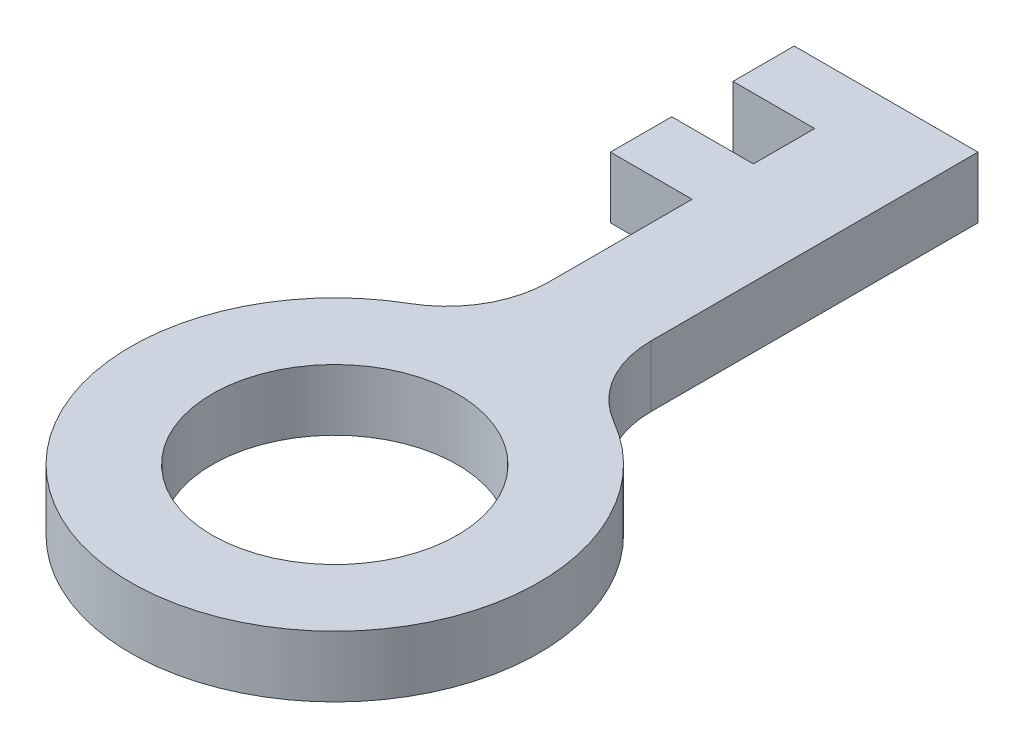
ISO-10303-21;
HEADER;
FILE_DESCRIPTION(('STEP AP214'),'2;1');
FILE_NAME('part.step','',(''),(''),'','','');
FILE_SCHEMA(('AUTOMOTIVE_DESIGN { 1 0 10303 214 1 1 1 1 }'));
ENDSEC;
DATA;
#1=APPLICATION_CONTEXT('core data for automotive mechanical design processes');
#2=APPLICATION_PROTOCOL_DEFINITION('international standard','automotive_design',2000,#1);
#3=PRODUCT_CONTEXT('',#1,'mechanical');
#4=PRODUCT('Part','Part','',(#3));
#5=PRODUCT_RELATED_PRODUCT_CATEGORY('part','',(#4));
#6=PRODUCT_DEFINITION_FORMATION('','',#4);
#7=PRODUCT_DEFINITION_CONTEXT('part definition',#1,'design');
#8=PRODUCT_DEFINITION('design','',#6,#7);
#9=PRODUCT_DEFINITION_SHAPE('','',#8);
#10=(LENGTH_UNIT() NAMED_UNIT(*) SI_UNIT(.MILLI.,.METRE.));
#11=(NAMED_UNIT(*) PLANE_ANGLE_UNIT() SI_UNIT($,.RADIAN.));
#12=(NAMED_UNIT(*) SI_UNIT($,.STERADIAN.) SOLID_ANGLE_UNIT());
#13=UNCERTAINTY_MEASURE_WITH_UNIT(LENGTH_MEASURE(1.E-05),#10,'distance_accuracy_value','');
#14=(GEOMETRIC_REPRESENTATION_CONTEXT(3) GLOBAL_UNCERTAINTY_ASSIGNED_CONTEXT((#13)) GLOBAL_UNIT_ASSIGNED_CONTEXT((#10,
#11,#12)) REPRESENTATION_CONTEXT('',''));
#15=CARTESIAN_POINT('',(0.,0.,0.));
#16=DIRECTION('',(0.,0.,1.));
#17=DIRECTION('',(1.,0.,0.));
#18=AXIS2_PLACEMENT_3D('',#15,#16,#17);
#19=CARTESIAN_POINT('',(-2.5,0.,-9.));
#20=DIRECTION('',(-1.,0.,0.));
#21=DIRECTION('',(0.,0.,1.));
#22=AXIS2_PLACEMENT_3D('',#19,#20,#21);
#23=PLANE('',#22);
#24=DIRECTION('',(0.,0.,1.));
#25=VECTOR('',#24,1.);
#26=CARTESIAN_POINT('',(-2.5,0.,-9.));
#27=LINE('',#26,#25);
#28=CARTESIAN_POINT('',(-2.5,0.,-26.));
#29=VERTEX_POINT('',#28);
#30=CARTESIAN_POINT('',(-2.5,0.,-23.));
#31=VERTEX_POINT('',#30);
#32=EDGE_CURVE('E169',#29,#31,#27,.T.);
#33=ORIENTED_EDGE('',*,*,#32,.T.);
#34=DIRECTION('',(0.,-1.,0.));
#35=VECTOR('',#34,1.);
#36=CARTESIAN_POINT('',(-2.5,0.,-23.));
#37=LINE('',#36,#35);
#38=CARTESIAN_POINT('',(-2.5,3.,-23.));
#39=VERTEX_POINT('',#38);
#40=EDGE_CURVE('E145',#39,#31,#37,.T.);
#41=ORIENTED_EDGE('',*,*,#40,.F.);
#42=DIRECTION('',(0.,0.,1.));
#43=VECTOR('',#42,1.);
#44=CARTESIAN_POINT('',(-2.5,3.,-9.));
#45=LINE('',#44,#43);
#46=CARTESIAN_POINT('',(-2.5,3.,-26.));
#47=VERTEX_POINT('',#46);
#48=EDGE_CURVE('E177',#47,#39,#45,.T.);
#49=ORIENTED_EDGE('',*,*,#48,.F.);
#50=DIRECTION('',(0.,1.,0.));
#51=VECTOR('',#50,1.);
#52=CARTESIAN_POINT('',(-2.5,0.,-26.));
#53=LINE('',#52,#51);
#54=EDGE_CURVE('E146',#29,#47,#53,.T.);
#55=ORIENTED_EDGE('',*,*,#54,.F.);
#56=EDGE_LOOP('',(#33,#41,#49,#55));
#57=FACE_BOUND('',#56,.T.);
#58=ADVANCED_FACE('F33',(#57),#23,.T.);
#59=CARTESIAN_POINT('',(-2.5,0.,-20.));
#60=VERTEX_POINT('',#59);
#61=CARTESIAN_POINT('',(-2.5,0.,-12.9903810567666));
#62=VERTEX_POINT('',#61);
#63=EDGE_CURVE('E172',#60,#62,#27,.T.);
#64=ORIENTED_EDGE('',*,*,#63,.T.);
#65=DIRECTION('',(0.,-1.,0.));
#66=VECTOR('',#65,1.);
#67=CARTESIAN_POINT('',(-2.5,0.,-12.9903810567666));
#68=LINE('',#67,#66);
#69=CARTESIAN_POINT('',(-2.5,3.,-12.9903810567666));
#70=VERTEX_POINT('',#69);
#71=EDGE_CURVE('E197',#62,#70,#68,.F.);
#72=ORIENTED_EDGE('',*,*,#71,.T.);
#73=CARTESIAN_POINT('',(-2.5,3.,-20.));
#74=VERTEX_POINT('',#73);
#75=EDGE_CURVE('E168',#74,#70,#45,.T.);
#76=ORIENTED_EDGE('',*,*,#75,.F.);
#77=DIRECTION('',(0.,1.,0.));
#78=VECTOR('',#77,1.);
#79=CARTESIAN_POINT('',(-2.5,0.,-20.));
#80=LINE('',#79,#78);
#81=EDGE_CURVE('E142',#60,#74,#80,.T.);
#82=ORIENTED_EDGE('',*,*,#81,.F.);
#83=EDGE_LOOP('',(#64,#72,#76,#82));
#84=FACE_BOUND('',#83,.T.);
#85=ADVANCED_FACE('F218',(#84),#23,.T.);
#86=CARTESIAN_POINT('',(0.,3.,0.));
#87=DIRECTION('',(0.,-1.,0.));
#88=DIRECTION('',(0.,0.,-1.));
#89=AXIS2_PLACEMENT_3D('',#86,#87,#88);
#90=CYLINDRICAL_SURFACE('',#89,10.);
#91=CARTESIAN_POINT('',(0.,3.,0.));
#92=DIRECTION('',(0.,1.,0.));
#93=DIRECTION('',(0.,0.,1.));
#94=AXIS2_PLACEMENT_3D('',#91,#92,#93);
#95=CIRCLE('',#94,10.);
#96=CARTESIAN_POINT('',(-5.,3.,-8.66025403784439));
#97=VERTEX_POINT('',#96);
#98=CARTESIAN_POINT('',(5.,3.,-8.66025403784439));
#99=VERTEX_POINT('',#98);
#100=EDGE_CURVE('E187',#97,#99,#95,.T.);
#101=ORIENTED_EDGE('',*,*,#100,.F.);
#102=DIRECTION('',(0.,-1.,0.));
#103=VECTOR('',#102,1.);
#104=CARTESIAN_POINT('',(-5.,3.,-8.66025403784439));
#105=LINE('',#104,#103);
#106=CARTESIAN_POINT('',(-5.,0.,-8.66025403784439));
#107=VERTEX_POINT('',#106);
#108=EDGE_CURVE('E194',#97,#107,#105,.T.);
#109=ORIENTED_EDGE('',*,*,#108,.T.);
#110=CARTESIAN_POINT('',(0.,0.,0.));
#111=DIRECTION('',(0.,1.,0.));
#112=DIRECTION('',(0.,0.,1.));
#113=AXIS2_PLACEMENT_3D('',#110,#111,#112);
#114=CIRCLE('',#113,10.);
#115=CARTESIAN_POINT('',(5.,0.,-8.66025403784439));
#116=VERTEX_POINT('',#115);
#117=EDGE_CURVE('E186',#107,#116,#114,.T.);
#118=ORIENTED_EDGE('',*,*,#117,.T.);
#119=DIRECTION('',(0.,-1.,0.));
#120=VECTOR('',#119,1.);
#121=CARTESIAN_POINT('',(5.,3.,-8.66025403784439));
#122=LINE('',#121,#120);
#123=EDGE_CURVE('E189',#116,#99,#122,.F.);
#124=ORIENTED_EDGE('',*,*,#123,.T.);
#125=EDGE_LOOP('',(#101,#109,#118,#124));
#126=FACE_BOUND('',#125,.T.);
#127=ADVANCED_FACE('F212',(#126),#90,.T.);
#128=CARTESIAN_POINT('',(0.,3.,0.));
#129=DIRECTION('',(0.,1.,0.));
#130=DIRECTION('',(0.,0.,1.));
#131=AXIS2_PLACEMENT_3D('',#128,#129,#130);
#132=PLANE('',#131);
#133=CARTESIAN_POINT('',(0.,3.,0.));
#134=DIRECTION('',(0.,1.,0.));
#135=DIRECTION('',(0.,0.,1.));
#136=AXIS2_PLACEMENT_3D('',#133,#134,#135);
#137=CIRCLE('',#136,6.);
#138=CARTESIAN_POINT('',(0.,3.,6.));
#139=VERTEX_POINT('',#138);
#140=EDGE_CURVE('E398',#139,#139,#137,.T.);
#141=ORIENTED_EDGE('',*,*,#140,.F.);
#142=EDGE_LOOP('',(#141));
#143=FACE_BOUND('',#142,.T.);
#144=ORIENTED_EDGE('',*,*,#75,.T.);
#145=CARTESIAN_POINT('',(-7.5,3.,-12.9903810567666));
#146=DIRECTION('',(0.,1.,0.));
#147=DIRECTION('',(0.,0.,1.));
#148=AXIS2_PLACEMENT_3D('',#145,#146,#147);
#149=CIRCLE('',#148,5.);
#150=EDGE_CURVE('E202',#70,#97,#149,.F.);
#151=ORIENTED_EDGE('',*,*,#150,.T.);
#152=ORIENTED_EDGE('',*,*,#100,.T.);
#153=CARTESIAN_POINT('',(7.5,3.,-12.9903810567666));
#154=DIRECTION('',(0.,1.,0.));
#155=DIRECTION('',(0.,0.,1.));
#156=AXIS2_PLACEMENT_3D('',#153,#154,#155);
#157=CIRCLE('',#156,5.);
#158=CARTESIAN_POINT('',(2.5,3.,-12.9903810567666));
#159=VERTEX_POINT('',#158);
#160=EDGE_CURVE('E41',#99,#159,#157,.F.);
#161=ORIENTED_EDGE('',*,*,#160,.T.);
#162=DIRECTION('',(0.,0.,-1.));
#163=VECTOR('',#162,1.);
#164=CARTESIAN_POINT('',(2.5,3.,-9.));
#165=LINE('',#164,#163);
#166=CARTESIAN_POINT('',(2.5,3.,-29.));
#167=VERTEX_POINT('',#166);
#168=EDGE_CURVE('E180',#159,#167,#165,.T.);
#169=ORIENTED_EDGE('',*,*,#168,.T.);
#170=DIRECTION('',(-1.,0.,0.));
#171=VECTOR('',#170,1.);
#172=CARTESIAN_POINT('',(-2.5,3.,-29.));
#173=LINE('',#172,#171);
#174=CARTESIAN_POINT('',(-6.5,3.,-29.));
#175=VERTEX_POINT('',#174);
#176=EDGE_CURVE('E182',#167,#175,#173,.T.);
#177=ORIENTED_EDGE('',*,*,#176,.T.);
#178=DIRECTION('',(0.,0.,-1.));
#179=VECTOR('',#178,1.);
#180=CARTESIAN_POINT('',(-6.5,3.,-29.));
#181=LINE('',#180,#179);
#182=CARTESIAN_POINT('',(-6.5,3.,-26.));
#183=VERTEX_POINT('',#182);
#184=EDGE_CURVE('E160',#183,#175,#181,.T.);
#185=ORIENTED_EDGE('',*,*,#184,.F.);
#186=DIRECTION('',(1.,0.,0.));
#187=VECTOR('',#186,1.);
#188=CARTESIAN_POINT('',(-6.5,3.,-26.));
#189=LINE('',#188,#187);
#190=EDGE_CURVE('E162',#183,#47,#189,.T.);
#191=ORIENTED_EDGE('',*,*,#190,.T.);
#192=ORIENTED_EDGE('',*,*,#48,.T.);
#193=DIRECTION('',(1.,0.,0.));
#194=VECTOR('',#193,1.);
#195=CARTESIAN_POINT('',(-6.5,3.,-23.));
#196=LINE('',#195,#194);
#197=CARTESIAN_POINT('',(-6.5,3.,-23.));
#198=VERTEX_POINT('',#197);
#199=EDGE_CURVE('E225',#198,#39,#196,.T.);
#200=ORIENTED_EDGE('',*,*,#199,.F.);
#201=DIRECTION('',(0.,0.,-1.));
#202=VECTOR('',#201,1.);
#203=CARTESIAN_POINT('',(-6.5,3.,-23.));
#204=LINE('',#203,#202);
#205=CARTESIAN_POINT('',(-6.5,3.,-20.));
#206=VERTEX_POINT('',#205);
#207=EDGE_CURVE('E138',#206,#198,#204,.T.);
#208=ORIENTED_EDGE('',*,*,#207,.F.);
#209=DIRECTION('',(1.,0.,0.));
#210=VECTOR('',#209,1.);
#211=CARTESIAN_POINT('',(-6.5,3.,-20.));
#212=LINE('',#211,#210);
#213=EDGE_CURVE('E150',#206,#74,#212,.T.);
#214=ORIENTED_EDGE('',*,*,#213,.T.);
#215=EDGE_LOOP('',(#144,#151,#152,#161,#169,#177,#185,#191,#192,#200,#208,#214));
#216=FACE_BOUND('',#215,.T.);
#217=ADVANCED_FACE('F206',(#143,#216),#132,.T.);
#218=CARTESIAN_POINT('',(0.,0.,0.));
#219=DIRECTION('',(0.,1.,0.));
#220=DIRECTION('',(0.,0.,1.));
#221=AXIS2_PLACEMENT_3D('',#218,#219,#220);
#222=PLANE('',#221);
#223=CARTESIAN_POINT('',(0.,0.,0.));
#224=DIRECTION('',(0.,1.,0.));
#225=DIRECTION('',(0.,0.,1.));
#226=AXIS2_PLACEMENT_3D('',#223,#224,#225);
#227=CIRCLE('',#226,6.);
#228=CARTESIAN_POINT('',(0.,0.,6.));
#229=VERTEX_POINT('',#228);
#230=EDGE_CURVE('E228',#229,#229,#227,.T.);
#231=ORIENTED_EDGE('',*,*,#230,.T.);
#232=EDGE_LOOP('',(#231));
#233=FACE_BOUND('',#232,.T.);
#234=ORIENTED_EDGE('',*,*,#117,.F.);
#235=CARTESIAN_POINT('',(-7.5,0.,-12.9903810567666));
#236=DIRECTION('',(0.,1.,0.));
#237=DIRECTION('',(0.,0.,1.));
#238=AXIS2_PLACEMENT_3D('',#235,#236,#237);
#239=CIRCLE('',#238,5.);
#240=EDGE_CURVE('E200',#107,#62,#239,.T.);
#241=ORIENTED_EDGE('',*,*,#240,.T.);
#242=ORIENTED_EDGE('',*,*,#63,.F.);
#243=DIRECTION('',(1.,0.,0.));
#244=VECTOR('',#243,1.);
#245=CARTESIAN_POINT('',(-6.5,0.,-20.));
#246=LINE('',#245,#244);
#247=CARTESIAN_POINT('',(-6.5,0.,-20.));
#248=VERTEX_POINT('',#247);
#249=EDGE_CURVE('E129',#248,#60,#246,.T.);
#250=ORIENTED_EDGE('',*,*,#249,.F.);
#251=DIRECTION('',(0.,0.,1.));
#252=VECTOR('',#251,1.);
#253=CARTESIAN_POINT('',(-6.5,0.,-23.));
#254=LINE('',#253,#252);
#255=CARTESIAN_POINT('',(-6.5,0.,-23.));
#256=VERTEX_POINT('',#255);
#257=EDGE_CURVE('E120',#256,#248,#254,.T.);
#258=ORIENTED_EDGE('',*,*,#257,.F.);
#259=DIRECTION('',(1.,0.,0.));
#260=VECTOR('',#259,1.);
#261=CARTESIAN_POINT('',(-6.5,0.,-23.));
#262=LINE('',#261,#260);
#263=EDGE_CURVE('E126',#256,#31,#262,.T.);
#264=ORIENTED_EDGE('',*,*,#263,.T.);
#265=ORIENTED_EDGE('',*,*,#32,.F.);
#266=DIRECTION('',(1.,0.,0.));
#267=VECTOR('',#266,1.);
#268=CARTESIAN_POINT('',(-6.5,0.,-26.));
#269=LINE('',#268,#267);
#270=CARTESIAN_POINT('',(-6.5,0.,-26.));
#271=VERTEX_POINT('',#270);
#272=EDGE_CURVE('E166',#271,#29,#269,.T.);
#273=ORIENTED_EDGE('',*,*,#272,.F.);
#274=DIRECTION('',(0.,0.,1.));
#275=VECTOR('',#274,1.);
#276=CARTESIAN_POINT('',(-6.5,0.,-29.));
#277=LINE('',#276,#275);
#278=CARTESIAN_POINT('',(-6.5,0.,-29.));
#279=VERTEX_POINT('',#278);
#280=EDGE_CURVE('E156',#279,#271,#277,.T.);
#281=ORIENTED_EDGE('',*,*,#280,.F.);
#282=DIRECTION('',(-1.,0.,0.));
#283=VECTOR('',#282,1.);
#284=CARTESIAN_POINT('',(-2.5,0.,-29.));
#285=LINE('',#284,#283);
#286=CARTESIAN_POINT('',(2.5,0.,-29.));
#287=VERTEX_POINT('',#286);
#288=EDGE_CURVE('E174',#287,#279,#285,.T.);
#289=ORIENTED_EDGE('',*,*,#288,.F.);
#290=DIRECTION('',(0.,0.,-1.));
#291=VECTOR('',#290,1.);
#292=CARTESIAN_POINT('',(2.5,0.,-9.));
#293=LINE('',#292,#291);
#294=CARTESIAN_POINT('',(2.5,0.,-12.9903810567666));
#295=VERTEX_POINT('',#294);
#296=EDGE_CURVE('E171',#295,#287,#293,.T.);
#297=ORIENTED_EDGE('',*,*,#296,.F.);
#298=CARTESIAN_POINT('',(7.5,0.,-12.9903810567666));
#299=DIRECTION('',(0.,1.,0.));
#300=DIRECTION('',(0.,0.,1.));
#301=AXIS2_PLACEMENT_3D('',#298,#299,#300);
#302=CIRCLE('',#301,5.);
#303=EDGE_CURVE('E11',#295,#116,#302,.T.);
#304=ORIENTED_EDGE('',*,*,#303,.T.);
#305=EDGE_LOOP('',(#234,#241,#242,#250,#258,#264,#265,#273,#281,#289,#297,#304));
#306=FACE_BOUND('',#305,.T.);
#307=ADVANCED_FACE('F123',(#233,#306),#222,.F.);
#308=CARTESIAN_POINT('',(2.5,0.,-9.));
#309=DIRECTION('',(1.,0.,0.));
#310=DIRECTION('',(0.,0.,-1.));
#311=AXIS2_PLACEMENT_3D('',#308,#309,#310);
#312=PLANE('',#311);
#313=ORIENTED_EDGE('',*,*,#168,.F.);
#314=DIRECTION('',(0.,-1.,0.));
#315=VECTOR('',#314,1.);
#316=CARTESIAN_POINT('',(2.5,0.,-12.9903810567666));
#317=LINE('',#316,#315);
#318=EDGE_CURVE('E54',#159,#295,#317,.T.);
#319=ORIENTED_EDGE('',*,*,#318,.T.);
#320=ORIENTED_EDGE('',*,*,#296,.T.);
#321=DIRECTION('',(0.,1.,0.));
#322=VECTOR('',#321,1.);
#323=CARTESIAN_POINT('',(2.5,0.,-29.));
#324=LINE('',#323,#322);
#325=EDGE_CURVE('E176',#287,#167,#324,.T.);
#326=ORIENTED_EDGE('',*,*,#325,.T.);
#327=EDGE_LOOP('',(#313,#319,#320,#326));
#328=FACE_BOUND('',#327,.T.);
#329=ADVANCED_FACE('F262',(#328),#312,.T.);
#330=CARTESIAN_POINT('',(-2.5,0.,-29.));
#331=DIRECTION('',(0.,0.,-1.));
#332=DIRECTION('',(-1.,0.,0.));
#333=AXIS2_PLACEMENT_3D('',#330,#331,#332);
#334=PLANE('',#333);
#335=ORIENTED_EDGE('',*,*,#176,.F.);
#336=ORIENTED_EDGE('',*,*,#325,.F.);
#337=ORIENTED_EDGE('',*,*,#288,.T.);
#338=DIRECTION('',(0.,-1.,0.));
#339=VECTOR('',#338,1.);
#340=CARTESIAN_POINT('',(-6.5,0.,-29.));
#341=LINE('',#340,#339);
#342=EDGE_CURVE('E148',#175,#279,#341,.T.);
#343=ORIENTED_EDGE('',*,*,#342,.F.);
#344=EDGE_LOOP('',(#335,#336,#337,#343));
#345=FACE_BOUND('',#344,.T.);
#346=ADVANCED_FACE('F246',(#345),#334,.T.);
#347=CARTESIAN_POINT('',(-6.5,0.,-26.));
#348=DIRECTION('',(0.,0.,-1.));
#349=DIRECTION('',(-1.,0.,0.));
#350=AXIS2_PLACEMENT_3D('',#347,#348,#349);
#351=PLANE('',#350);
#352=ORIENTED_EDGE('',*,*,#54,.T.);
#353=ORIENTED_EDGE('',*,*,#190,.F.);
#354=DIRECTION('',(0.,1.,0.));
#355=VECTOR('',#354,1.);
#356=CARTESIAN_POINT('',(-6.5,0.,-26.));
#357=LINE('',#356,#355);
#358=EDGE_CURVE('E158',#271,#183,#357,.T.);
#359=ORIENTED_EDGE('',*,*,#358,.F.);
#360=ORIENTED_EDGE('',*,*,#272,.T.);
#361=EDGE_LOOP('',(#352,#353,#359,#360));
#362=FACE_BOUND('',#361,.T.);
#363=ADVANCED_FACE('F240',(#362),#351,.F.);
#364=CARTESIAN_POINT('',(-6.5,0.,0.));
#365=DIRECTION('',(1.,0.,0.));
#366=DIRECTION('',(0.,0.,-1.));
#367=AXIS2_PLACEMENT_3D('',#364,#365,#366);
#368=PLANE('',#367);
#369=ORIENTED_EDGE('',*,*,#342,.T.);
#370=ORIENTED_EDGE('',*,*,#280,.T.);
#371=ORIENTED_EDGE('',*,*,#358,.T.);
#372=ORIENTED_EDGE('',*,*,#184,.T.);
#373=EDGE_LOOP('',(#369,#370,#371,#372));
#374=FACE_BOUND('',#373,.T.);
#375=ADVANCED_FACE('F242',(#374),#368,.F.);
#376=CARTESIAN_POINT('',(-6.5,0.,-23.));
#377=DIRECTION('',(0.,0.,1.));
#378=DIRECTION('',(1.,0.,0.));
#379=AXIS2_PLACEMENT_3D('',#376,#377,#378);
#380=PLANE('',#379);
#381=ORIENTED_EDGE('',*,*,#40,.T.);
#382=ORIENTED_EDGE('',*,*,#263,.F.);
#383=DIRECTION('',(0.,-1.,0.));
#384=VECTOR('',#383,1.);
#385=CARTESIAN_POINT('',(-6.5,0.,-23.));
#386=LINE('',#385,#384);
#387=EDGE_CURVE('E133',#198,#256,#386,.T.);
#388=ORIENTED_EDGE('',*,*,#387,.F.);
#389=ORIENTED_EDGE('',*,*,#199,.T.);
#390=EDGE_LOOP('',(#381,#382,#388,#389));
#391=FACE_BOUND('',#390,.T.);
#392=ADVANCED_FACE('F144',(#391),#380,.F.);
#393=CARTESIAN_POINT('',(-6.5,0.,-20.));
#394=DIRECTION('',(0.,0.,-1.));
#395=DIRECTION('',(-1.,0.,0.));
#396=AXIS2_PLACEMENT_3D('',#393,#394,#395);
#397=PLANE('',#396);
#398=ORIENTED_EDGE('',*,*,#81,.T.);
#399=ORIENTED_EDGE('',*,*,#213,.F.);
#400=DIRECTION('',(0.,1.,0.));
#401=VECTOR('',#400,1.);
#402=CARTESIAN_POINT('',(-6.5,0.,-20.));
#403=LINE('',#402,#401);
#404=EDGE_CURVE('E132',#248,#206,#403,.T.);
#405=ORIENTED_EDGE('',*,*,#404,.F.);
#406=ORIENTED_EDGE('',*,*,#249,.T.);
#407=EDGE_LOOP('',(#398,#399,#405,#406));
#408=FACE_BOUND('',#407,.T.);
#409=ADVANCED_FACE('F223',(#408),#397,.F.);
#410=CARTESIAN_POINT('',(-6.5,0.,0.));
#411=DIRECTION('',(1.,0.,0.));
#412=DIRECTION('',(0.,0.,-1.));
#413=AXIS2_PLACEMENT_3D('',#410,#411,#412);
#414=PLANE('',#413);
#415=ORIENTED_EDGE('',*,*,#387,.T.);
#416=ORIENTED_EDGE('',*,*,#257,.T.);
#417=ORIENTED_EDGE('',*,*,#404,.T.);
#418=ORIENTED_EDGE('',*,*,#207,.T.);
#419=EDGE_LOOP('',(#415,#416,#417,#418));
#420=FACE_BOUND('',#419,.T.);
#421=ADVANCED_FACE('F136',(#420),#414,.F.);
#422=CARTESIAN_POINT('',(0.,0.,0.));
#423=DIRECTION('',(0.,1.,0.));
#424=DIRECTION('',(0.,0.,1.));
#425=AXIS2_PLACEMENT_3D('',#422,#423,#424);
#426=CYLINDRICAL_SURFACE('',#425,6.);
#427=ORIENTED_EDGE('',*,*,#230,.F.);
#428=EDGE_LOOP('',(#427));
#429=FACE_BOUND('',#428,.T.);
#430=ORIENTED_EDGE('',*,*,#140,.T.);
#431=EDGE_LOOP('',(#430));
#432=FACE_BOUND('',#431,.T.);
#433=ADVANCED_FACE('F254',(#429,#432),#426,.F.);
#434=CARTESIAN_POINT('',(-7.5,3.,-12.9903810567666));
#435=DIRECTION('',(0.,-1.,0.));
#436=DIRECTION('',(0.,0.,-1.));
#437=AXIS2_PLACEMENT_3D('',#434,#435,#436);
#438=CYLINDRICAL_SURFACE('',#437,5.);
#439=ORIENTED_EDGE('',*,*,#150,.F.);
#440=ORIENTED_EDGE('',*,*,#71,.F.);
#441=ORIENTED_EDGE('',*,*,#240,.F.);
#442=ORIENTED_EDGE('',*,*,#108,.F.);
#443=EDGE_LOOP('',(#439,#440,#441,#442));
#444=FACE_BOUND('',#443,.T.);
#445=ADVANCED_FACE('F214',(#444),#438,.F.);
#446=CARTESIAN_POINT('',(7.5,3.,-12.9903810567666));
#447=DIRECTION('',(0.,-1.,0.));
#448=DIRECTION('',(0.,0.,-1.));
#449=AXIS2_PLACEMENT_3D('',#446,#447,#448);
#450=CYLINDRICAL_SURFACE('',#449,5.);
#451=ORIENTED_EDGE('',*,*,#303,.F.);
#452=ORIENTED_EDGE('',*,*,#318,.F.);
#453=ORIENTED_EDGE('',*,*,#160,.F.);
#454=ORIENTED_EDGE('',*,*,#123,.F.);
#455=EDGE_LOOP('',(#451,#452,#453,#454));
#456=FACE_BOUND('',#455,.T.);
#457=ADVANCED_FACE('F35',(#456),#450,.F.);
#458=CLOSED_SHELL('',(#58,#85,#127,#217,#307,#329,#346,#363,#375,#392,#409,#421,#433,#445,#457));
#459=MANIFOLD_SOLID_BREP('B2',#458);
#460=ADVANCED_BREP_SHAPE_REPRESENTATION('',(#18,#459),#14);
#461=SHAPE_DEFINITION_REPRESENTATION(#9,#460);
ENDSEC;
END-ISO-10303-21;
